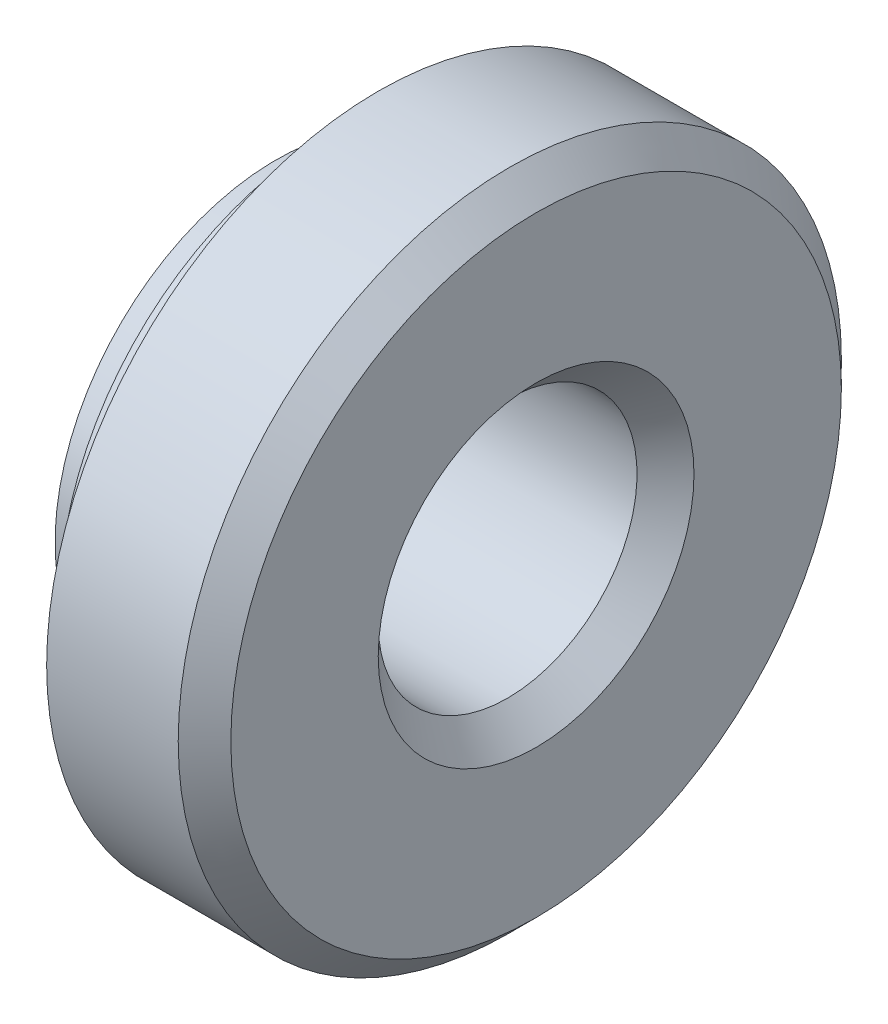
ISO-10303-21;
HEADER;
FILE_DESCRIPTION(('STEP AP214'),'2;1');
FILE_NAME('part.step','',(''),(''),'','','');
FILE_SCHEMA(('AUTOMOTIVE_DESIGN { 1 0 10303 214 1 1 1 1 }'));
ENDSEC;
DATA;
#1=APPLICATION_CONTEXT('core data for automotive mechanical design processes');
#2=APPLICATION_PROTOCOL_DEFINITION('international standard','automotive_design',2000,#1);
#3=PRODUCT_CONTEXT('',#1,'mechanical');
#4=PRODUCT('Part','Part','',(#3));
#5=PRODUCT_RELATED_PRODUCT_CATEGORY('part','',(#4));
#6=PRODUCT_DEFINITION_FORMATION('','',#4);
#7=PRODUCT_DEFINITION_CONTEXT('part definition',#1,'design');
#8=PRODUCT_DEFINITION('design','',#6,#7);
#9=PRODUCT_DEFINITION_SHAPE('','',#8);
#10=(LENGTH_UNIT() NAMED_UNIT(*) SI_UNIT(.MILLI.,.METRE.));
#11=(NAMED_UNIT(*) PLANE_ANGLE_UNIT() SI_UNIT($,.RADIAN.));
#12=(NAMED_UNIT(*) SI_UNIT($,.STERADIAN.) SOLID_ANGLE_UNIT());
#13=UNCERTAINTY_MEASURE_WITH_UNIT(LENGTH_MEASURE(1.E-05),#10,'distance_accuracy_value','');
#14=(GEOMETRIC_REPRESENTATION_CONTEXT(3) GLOBAL_UNCERTAINTY_ASSIGNED_CONTEXT((#13)) GLOBAL_UNIT_ASSIGNED_CONTEXT((#10,
#11,#12)) REPRESENTATION_CONTEXT('',''));
#15=CARTESIAN_POINT('',(0.,0.,0.));
#16=DIRECTION('',(0.,0.,1.));
#17=DIRECTION('',(1.,0.,0.));
#18=AXIS2_PLACEMENT_3D('',#15,#16,#17);
#19=CARTESIAN_POINT('',(0.223846154028706,0.,0.));
#20=DIRECTION('',(-1.,0.,0.));
#21=DIRECTION('',(0.,0.,1.00000000000001));
#22=AXIS2_PLACEMENT_3D('',#19,#20,#21);
#23=CONICAL_SURFACE('',#22,2.09999999997024,0.133226751625499);
#24=CARTESIAN_POINT('',(0.223846153846158,0.,0.));
#25=DIRECTION('',(1.,0.,0.));
#26=DIRECTION('',(0.,0.,-1.00000000000001));
#27=AXIS2_PLACEMENT_3D('',#24,#25,#26);
#28=CIRCLE('',#27,2.1);
#29=CARTESIAN_POINT('',(0.223846153846158,0.,-2.10000000000001));
#30=VERTEX_POINT('',#29);
#31=EDGE_CURVE('E29',#30,#30,#28,.F.);
#32=ORIENTED_EDGE('',*,*,#31,.F.);
#33=EDGE_LOOP('',(#32));
#34=FACE_BOUND('',#33,.T.);
#35=CARTESIAN_POINT('',(0.484999999969205,0.,0.));
#36=DIRECTION('',(-1.,0.,0.));
#37=DIRECTION('',(0.,0.,1.00000000000001));
#38=AXIS2_PLACEMENT_3D('',#35,#36,#37);
#39=CIRCLE('',#38,2.06500000000279);
#40=CARTESIAN_POINT('',(0.484999999969204,0.,2.0650000000028));
#41=VERTEX_POINT('',#40);
#42=EDGE_CURVE('E17',#41,#41,#39,.F.);
#43=ORIENTED_EDGE('',*,*,#42,.F.);
#44=EDGE_LOOP('',(#43));
#45=FACE_BOUND('',#44,.T.);
#46=ADVANCED_FACE('F14',(#34,#45),#23,.T.);
#47=CARTESIAN_POINT('',(0.111923076923065,0.,0.));
#48=DIRECTION('',(1.,0.,0.));
#49=DIRECTION('',(0.,0.,-1.00000000000001));
#50=AXIS2_PLACEMENT_3D('',#47,#48,#49);
#51=CYLINDRICAL_SURFACE('',#50,2.1);
#52=ORIENTED_EDGE('',*,*,#31,.T.);
#53=EDGE_LOOP('',(#52));
#54=FACE_BOUND('',#53,.T.);
#55=CARTESIAN_POINT('',(0.,0.,0.));
#56=DIRECTION('',(1.,0.,0.));
#57=DIRECTION('',(0.,0.,-1.00000000000001));
#58=AXIS2_PLACEMENT_3D('',#55,#56,#57);
#59=CIRCLE('',#58,2.1);
#60=CARTESIAN_POINT('',(0.,0.,-2.10000000000001));
#61=VERTEX_POINT('',#60);
#62=EDGE_CURVE('E45',#61,#61,#59,.F.);
#63=ORIENTED_EDGE('',*,*,#62,.F.);
#64=EDGE_LOOP('',(#63));
#65=FACE_BOUND('',#64,.T.);
#66=ADVANCED_FACE('F55',(#54,#65),#51,.T.);
#67=CARTESIAN_POINT('',(0.485000000000013,0.,0.));
#68=DIRECTION('',(-1.,0.,0.));
#69=DIRECTION('',(0.,0.,1.00000000000001));
#70=AXIS2_PLACEMENT_3D('',#67,#68,#69);
#71=PLANE('',#70);
#72=CARTESIAN_POINT('',(0.485000000000013,0.,0.));
#73=DIRECTION('',(-1.,0.,0.));
#74=DIRECTION('',(0.,0.,1.00000000000001));
#75=AXIS2_PLACEMENT_3D('',#72,#73,#74);
#76=CIRCLE('',#75,2.541);
#77=CARTESIAN_POINT('',(0.485000000000013,0.,2.54100000000001));
#78=VERTEX_POINT('',#77);
#79=EDGE_CURVE('E43',#78,#78,#76,.F.);
#80=ORIENTED_EDGE('',*,*,#79,.F.);
#81=EDGE_LOOP('',(#80));
#82=FACE_BOUND('',#81,.T.);
#83=ORIENTED_EDGE('',*,*,#42,.T.);
#84=EDGE_LOOP('',(#83));
#85=FACE_BOUND('',#84,.T.);
#86=ADVANCED_FACE('F64',(#82,#85),#71,.T.);
#87=CARTESIAN_POINT('',(0.,0.,1.05000000000016));
#88=DIRECTION('',(-1.,0.,0.));
#89=DIRECTION('',(0.,0.,1.00000000000001));
#90=AXIS2_PLACEMENT_3D('',#87,#88,#89);
#91=PLANE('',#90);
#92=ORIENTED_EDGE('',*,*,#62,.T.);
#93=EDGE_LOOP('',(#92));
#94=FACE_BOUND('',#93,.T.);
#95=CARTESIAN_POINT('',(0.,0.,0.));
#96=DIRECTION('',(-1.,0.,0.));
#97=DIRECTION('',(0.,-1.,0.));
#98=AXIS2_PLACEMENT_3D('',#95,#96,#97);
#99=CIRCLE('',#98,1.50000000002137);
#100=CARTESIAN_POINT('',(0.,-1.50000000002137,0.));
#101=VERTEX_POINT('',#100);
#102=EDGE_CURVE('E40',#101,#101,#99,.F.);
#103=ORIENTED_EDGE('',*,*,#102,.T.);
#104=EDGE_LOOP('',(#103));
#105=FACE_BOUND('',#104,.T.);
#106=ADVANCED_FACE('F99',(#94,#105),#91,.T.);
#107=CARTESIAN_POINT('',(0.727499999999992,0.,0.));
#108=DIRECTION('',(-1.,0.,0.));
#109=DIRECTION('',(0.,0.,1.00000000000001));
#110=AXIS2_PLACEMENT_3D('',#107,#108,#109);
#111=CYLINDRICAL_SURFACE('',#110,2.541);
#112=CARTESIAN_POINT('',(0.969999999999999,0.,0.));
#113=DIRECTION('',(-1.,0.,0.));
#114=DIRECTION('',(0.,0.,1.00000000000001));
#115=AXIS2_PLACEMENT_3D('',#112,#113,#114);
#116=CIRCLE('',#115,2.541);
#117=CARTESIAN_POINT('',(0.969999999999998,0.,2.54100000000001));
#118=VERTEX_POINT('',#117);
#119=EDGE_CURVE('E37',#118,#118,#116,.F.);
#120=ORIENTED_EDGE('',*,*,#119,.F.);
#121=EDGE_LOOP('',(#120));
#122=FACE_BOUND('',#121,.T.);
#123=ORIENTED_EDGE('',*,*,#79,.T.);
#124=EDGE_LOOP('',(#123));
#125=FACE_BOUND('',#124,.T.);
#126=ADVANCED_FACE('F95',(#122,#125),#111,.T.);
#127=CARTESIAN_POINT('',(0.,0.,0.));
#128=DIRECTION('',(-1.,0.,0.));
#129=DIRECTION('',(0.,-1.,0.));
#130=AXIS2_PLACEMENT_3D('',#127,#128,#129);
#131=CONICAL_SURFACE('',#130,1.50000000002137,0.785398163397448);
#132=ORIENTED_EDGE('',*,*,#102,.F.);
#133=EDGE_LOOP('',(#132));
#134=FACE_BOUND('',#133,.T.);
#135=CARTESIAN_POINT('',(0.270500000000007,0.,0.));
#136=DIRECTION('',(-1.,0.,0.));
#137=DIRECTION('',(0.,-1.,0.));
#138=AXIS2_PLACEMENT_3D('',#135,#136,#137);
#139=CIRCLE('',#138,1.2295);
#140=CARTESIAN_POINT('',(0.270500000000007,-1.2295,0.));
#141=VERTEX_POINT('',#140);
#142=EDGE_CURVE('E36',#141,#141,#139,.F.);
#143=ORIENTED_EDGE('',*,*,#142,.T.);
#144=EDGE_LOOP('',(#143));
#145=FACE_BOUND('',#144,.T.);
#146=ADVANCED_FACE('F91',(#134,#145),#131,.F.);
#147=CARTESIAN_POINT('',(0.969999999999832,0.,1.5750000000001));
#148=DIRECTION('',(-1.,0.,0.));
#149=DIRECTION('',(0.,0.,1.00000000000001));
#150=AXIS2_PLACEMENT_3D('',#147,#148,#149);
#151=PLANE('',#150);
#152=CARTESIAN_POINT('',(0.969999999999999,0.,0.));
#153=DIRECTION('',(1.,0.,0.));
#154=DIRECTION('',(0.,0.,-1.00000000000001));
#155=AXIS2_PLACEMENT_3D('',#152,#153,#154);
#156=CIRCLE('',#155,3.15);
#157=CARTESIAN_POINT('',(0.969999999999999,0.,-3.15000000000002));
#158=VERTEX_POINT('',#157);
#159=EDGE_CURVE('E32',#158,#158,#156,.T.);
#160=ORIENTED_EDGE('',*,*,#159,.F.);
#161=EDGE_LOOP('',(#160));
#162=FACE_BOUND('',#161,.T.);
#163=ORIENTED_EDGE('',*,*,#119,.T.);
#164=EDGE_LOOP('',(#163));
#165=FACE_BOUND('',#164,.T.);
#166=ADVANCED_FACE('F87',(#162,#165),#151,.T.);
#167=CARTESIAN_POINT('',(1.23500000000001,0.,0.));
#168=DIRECTION('',(-1.,0.,0.));
#169=DIRECTION('',(0.,-1.,0.));
#170=AXIS2_PLACEMENT_3D('',#167,#168,#169);
#171=CYLINDRICAL_SURFACE('',#170,1.2295);
#172=ORIENTED_EDGE('',*,*,#142,.F.);
#173=EDGE_LOOP('',(#172));
#174=FACE_BOUND('',#173,.T.);
#175=CARTESIAN_POINT('',(2.19950000001745,0.,0.));
#176=DIRECTION('',(1.,0.,0.));
#177=DIRECTION('',(0.,0.,1.00000000000001));
#178=AXIS2_PLACEMENT_3D('',#175,#176,#177);
#179=CIRCLE('',#178,1.22949999996536);
#180=CARTESIAN_POINT('',(2.19950000001745,0.,1.22949999996536));
#181=VERTEX_POINT('',#180);
#182=EDGE_CURVE('E35',#181,#181,#179,.T.);
#183=ORIENTED_EDGE('',*,*,#182,.T.);
#184=EDGE_LOOP('',(#183));
#185=FACE_BOUND('',#184,.T.);
#186=ADVANCED_FACE('F83',(#174,#185),#171,.F.);
#187=CARTESIAN_POINT('',(1.59500000000001,0.,0.));
#188=DIRECTION('',(1.,0.,0.));
#189=DIRECTION('',(0.,0.,-1.00000000000001));
#190=AXIS2_PLACEMENT_3D('',#187,#188,#189);
#191=CYLINDRICAL_SURFACE('',#190,3.15);
#192=CARTESIAN_POINT('',(2.21999999996569,0.,0.));
#193=DIRECTION('',(-1.,0.,0.));
#194=DIRECTION('',(0.,0.,1.00000000000001));
#195=AXIS2_PLACEMENT_3D('',#192,#193,#194);
#196=CIRCLE('',#195,3.15000000006194);
#197=CARTESIAN_POINT('',(2.21999999996569,-1.3709033908341E-13,3.15000000006195));
#198=VERTEX_POINT('',#197);
#199=EDGE_CURVE('E26',#198,#198,#196,.F.);
#200=ORIENTED_EDGE('',*,*,#199,.F.);
#201=EDGE_LOOP('',(#200));
#202=FACE_BOUND('',#201,.T.);
#203=ORIENTED_EDGE('',*,*,#159,.T.);
#204=EDGE_LOOP('',(#203));
#205=FACE_BOUND('',#204,.T.);
#206=ADVANCED_FACE('F79',(#202,#205),#191,.T.);
#207=CARTESIAN_POINT('',(2.46999999995978,0.,0.));
#208=DIRECTION('',(1.,0.,0.));
#209=DIRECTION('',(0.,1.,0.));
#210=AXIS2_PLACEMENT_3D('',#207,#208,#209);
#211=CONICAL_SURFACE('',#210,1.49999999990769,0.785398163292377);
#212=ORIENTED_EDGE('',*,*,#182,.F.);
#213=EDGE_LOOP('',(#212));
#214=FACE_BOUND('',#213,.T.);
#215=CARTESIAN_POINT('',(2.47000000007347,0.,0.));
#216=DIRECTION('',(1.,0.,0.));
#217=DIRECTION('',(0.,0.,-1.00000000000001));
#218=AXIS2_PLACEMENT_3D('',#215,#216,#217);
#219=CIRCLE('',#218,1.50000000002137);
#220=CARTESIAN_POINT('',(2.47000000007347,0.,-1.50000000002138));
#221=VERTEX_POINT('',#220);
#222=EDGE_CURVE('E21',#221,#221,#219,.F.);
#223=ORIENTED_EDGE('',*,*,#222,.F.);
#224=EDGE_LOOP('',(#223));
#225=FACE_BOUND('',#224,.T.);
#226=ADVANCED_FACE('F72',(#214,#225),#211,.F.);
#227=CARTESIAN_POINT('',(2.21999999990885,0.,0.));
#228=DIRECTION('',(-1.,0.,0.));
#229=DIRECTION('',(0.,0.,1.00000000000001));
#230=AXIS2_PLACEMENT_3D('',#227,#228,#229);
#231=CONICAL_SURFACE('',#230,3.15000000011878,0.785398163511135);
#232=CARTESIAN_POINT('',(2.46999999990294,0.,0.));
#233=DIRECTION('',(-1.,0.,0.));
#234=DIRECTION('',(0.,0.,1.00000000000001));
#235=AXIS2_PLACEMENT_3D('',#232,#233,#234);
#236=CIRCLE('',#235,2.90000000006785);
#237=CARTESIAN_POINT('',(2.46999999990294,0.,2.90000000006787));
#238=VERTEX_POINT('',#237);
#239=EDGE_CURVE('E10',#238,#238,#236,.F.);
#240=ORIENTED_EDGE('',*,*,#239,.F.);
#241=EDGE_LOOP('',(#240));
#242=FACE_BOUND('',#241,.T.);
#243=ORIENTED_EDGE('',*,*,#199,.T.);
#244=EDGE_LOOP('',(#243));
#245=FACE_BOUND('',#244,.T.);
#246=ADVANCED_FACE('F67',(#242,#245),#231,.T.);
#247=CARTESIAN_POINT('',(2.47,0.,1.45000000000006));
#248=DIRECTION('',(1.,0.,0.));
#249=DIRECTION('',(0.,0.,-1.00000000000001));
#250=AXIS2_PLACEMENT_3D('',#247,#248,#249);
#251=PLANE('',#250);
#252=ORIENTED_EDGE('',*,*,#239,.T.);
#253=EDGE_LOOP('',(#252));
#254=FACE_BOUND('',#253,.T.);
#255=ORIENTED_EDGE('',*,*,#222,.T.);
#256=EDGE_LOOP('',(#255));
#257=FACE_BOUND('',#256,.T.);
#258=ADVANCED_FACE('F65',(#254,#257),#251,.T.);
#259=CLOSED_SHELL('',(#46,#66,#86,#106,#126,#146,#166,#186,#206,#226,#246,#258));
#260=MANIFOLD_SOLID_BREP('B1',#259);
#261=ADVANCED_BREP_SHAPE_REPRESENTATION('',(#18,#260),#14);
#262=SHAPE_DEFINITION_REPRESENTATION(#9,#261);
ENDSEC;
END-ISO-10303-21;
